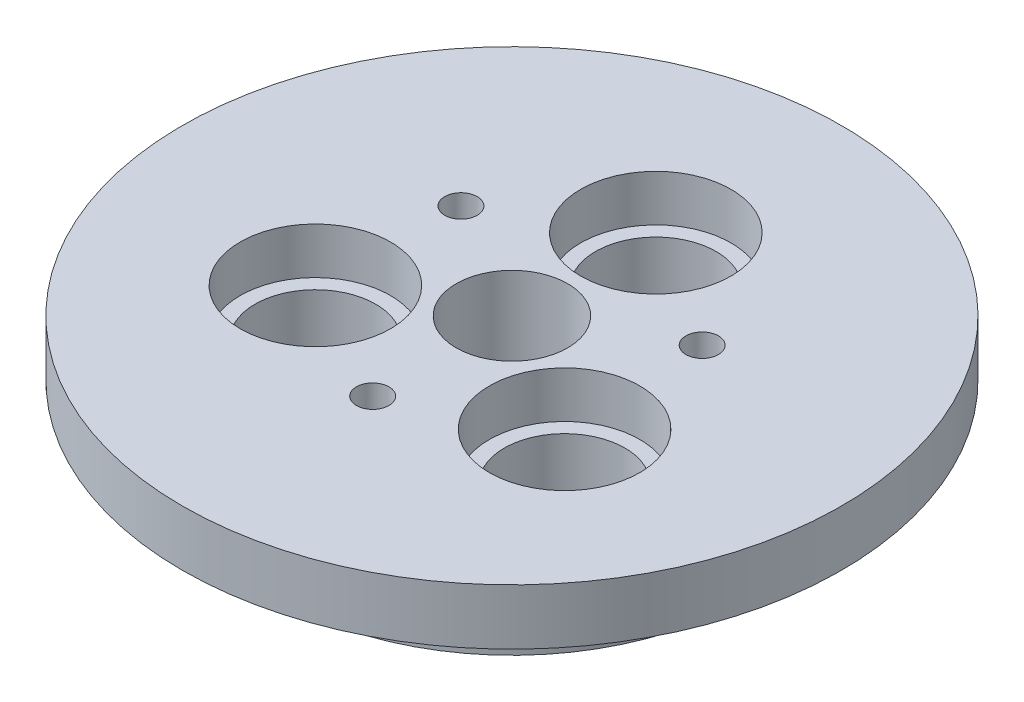
ISO-10303-21;
HEADER;
FILE_DESCRIPTION(('STEP AP214'),'2;1');
FILE_NAME('part.step','',(''),(''),'','','');
FILE_SCHEMA(('AUTOMOTIVE_DESIGN { 1 0 10303 214 1 1 1 1 }'));
ENDSEC;
DATA;
#1=APPLICATION_CONTEXT('core data for automotive mechanical design processes');
#2=APPLICATION_PROTOCOL_DEFINITION('international standard','automotive_design',2000,#1);
#3=PRODUCT_CONTEXT('',#1,'mechanical');
#4=PRODUCT('Part','Part','',(#3));
#5=PRODUCT_RELATED_PRODUCT_CATEGORY('part','',(#4));
#6=PRODUCT_DEFINITION_FORMATION('','',#4);
#7=PRODUCT_DEFINITION_CONTEXT('part definition',#1,'design');
#8=PRODUCT_DEFINITION('design','',#6,#7);
#9=PRODUCT_DEFINITION_SHAPE('','',#8);
#10=(LENGTH_UNIT() NAMED_UNIT(*) SI_UNIT(.MILLI.,.METRE.));
#11=(NAMED_UNIT(*) PLANE_ANGLE_UNIT() SI_UNIT($,.RADIAN.));
#12=(NAMED_UNIT(*) SI_UNIT($,.STERADIAN.) SOLID_ANGLE_UNIT());
#13=UNCERTAINTY_MEASURE_WITH_UNIT(LENGTH_MEASURE(1.E-05),#10,'distance_accuracy_value','');
#14=(GEOMETRIC_REPRESENTATION_CONTEXT(3) GLOBAL_UNCERTAINTY_ASSIGNED_CONTEXT((#13)) GLOBAL_UNIT_ASSIGNED_CONTEXT((#10,
#11,#12)) REPRESENTATION_CONTEXT('',''));
#15=CARTESIAN_POINT('',(0.,0.,0.));
#16=DIRECTION('',(0.,0.,1.));
#17=DIRECTION('',(1.,0.,0.));
#18=AXIS2_PLACEMENT_3D('',#15,#16,#17);
#19=CARTESIAN_POINT('',(0.,-3.,0.));
#20=DIRECTION('',(0.,1.,0.));
#21=DIRECTION('',(0.,0.,1.));
#22=AXIS2_PLACEMENT_3D('',#19,#20,#21);
#23=PLANE('',#22);
#24=CARTESIAN_POINT('',(0.,-3.,0.));
#25=DIRECTION('',(0.,1.,0.));
#26=DIRECTION('',(0.,0.,1.));
#27=AXIS2_PLACEMENT_3D('',#24,#25,#26);
#28=CIRCLE('',#27,27.);
#29=CARTESIAN_POINT('',(0.,-3.,27.));
#30=VERTEX_POINT('',#29);
#31=EDGE_CURVE('E10',#30,#30,#28,.T.);
#32=ORIENTED_EDGE('',*,*,#31,.T.);
#33=EDGE_LOOP('',(#32));
#34=FACE_BOUND('',#33,.T.);
#35=CARTESIAN_POINT('',(0.,-3.,0.));
#36=DIRECTION('',(0.,1.,0.));
#37=DIRECTION('',(0.,0.,1.));
#38=AXIS2_PLACEMENT_3D('',#35,#36,#37);
#39=CIRCLE('',#38,35.5);
#40=CARTESIAN_POINT('',(0.,-3.,35.5));
#41=VERTEX_POINT('',#40);
#42=EDGE_CURVE('E45',#41,#41,#39,.T.);
#43=ORIENTED_EDGE('',*,*,#42,.F.);
#44=EDGE_LOOP('',(#43));
#45=FACE_BOUND('',#44,.T.);
#46=ADVANCED_FACE('F33',(#34,#45),#23,.F.);
#47=CARTESIAN_POINT('',(0.,3.,0.));
#48=DIRECTION('',(0.,-1.,0.));
#49=DIRECTION('',(0.,0.,-1.));
#50=AXIS2_PLACEMENT_3D('',#47,#48,#49);
#51=CYLINDRICAL_SURFACE('',#50,35.5);
#52=CARTESIAN_POINT('',(0.,3.,0.));
#53=DIRECTION('',(0.,1.,0.));
#54=DIRECTION('',(0.,0.,1.));
#55=AXIS2_PLACEMENT_3D('',#52,#53,#54);
#56=CIRCLE('',#55,35.5);
#57=CARTESIAN_POINT('',(0.,3.,35.5));
#58=VERTEX_POINT('',#57);
#59=EDGE_CURVE('E41',#58,#58,#56,.T.);
#60=ORIENTED_EDGE('',*,*,#59,.F.);
#61=EDGE_LOOP('',(#60));
#62=FACE_BOUND('',#61,.T.);
#63=ORIENTED_EDGE('',*,*,#42,.T.);
#64=EDGE_LOOP('',(#63));
#65=FACE_BOUND('',#64,.T.);
#66=ADVANCED_FACE('F149',(#62,#65),#51,.T.);
#67=CARTESIAN_POINT('',(0.,3.,0.));
#68=DIRECTION('',(0.,1.,0.));
#69=DIRECTION('',(0.,0.,1.));
#70=AXIS2_PLACEMENT_3D('',#67,#68,#69);
#71=PLANE('',#70);
#72=CARTESIAN_POINT('',(0.,3.,-15.5));
#73=DIRECTION('',(0.,1.,0.));
#74=DIRECTION('',(0.,0.,1.));
#75=AXIS2_PLACEMENT_3D('',#72,#73,#74);
#76=CIRCLE('',#75,8.1);
#77=CARTESIAN_POINT('',(0.,3.,-7.4));
#78=VERTEX_POINT('',#77);
#79=EDGE_CURVE('E98',#78,#78,#76,.T.);
#80=ORIENTED_EDGE('',*,*,#79,.F.);
#81=EDGE_LOOP('',(#80));
#82=FACE_BOUND('',#81,.T.);
#83=CARTESIAN_POINT('',(13.4233937586588,3.,7.74999999999999));
#84=DIRECTION('',(0.,1.,0.));
#85=DIRECTION('',(0.,0.,1.));
#86=AXIS2_PLACEMENT_3D('',#83,#84,#85);
#87=CIRCLE('',#86,8.10000000000009);
#88=CARTESIAN_POINT('',(13.4233937586588,3.,15.8500000000001));
#89=VERTEX_POINT('',#88);
#90=EDGE_CURVE('E92',#89,#89,#87,.T.);
#91=ORIENTED_EDGE('',*,*,#90,.F.);
#92=EDGE_LOOP('',(#91));
#93=FACE_BOUND('',#92,.T.);
#94=CARTESIAN_POINT('',(-13.4233937586588,3.,7.74999999999999));
#95=DIRECTION('',(0.,1.,0.));
#96=DIRECTION('',(0.,0.,1.));
#97=AXIS2_PLACEMENT_3D('',#94,#95,#96);
#98=CIRCLE('',#97,8.1);
#99=CARTESIAN_POINT('',(-13.4233937586588,3.,15.85));
#100=VERTEX_POINT('',#99);
#101=EDGE_CURVE('E85',#100,#100,#98,.T.);
#102=ORIENTED_EDGE('',*,*,#101,.F.);
#103=EDGE_LOOP('',(#102));
#104=FACE_BOUND('',#103,.T.);
#105=ORIENTED_EDGE('',*,*,#59,.T.);
#106=EDGE_LOOP('',(#105));
#107=FACE_BOUND('',#106,.T.);
#108=CARTESIAN_POINT('',(12.9903810567666,3.,-7.50000000000001));
#109=DIRECTION('',(0.,-1.,0.));
#110=DIRECTION('',(0.,0.,-1.));
#111=AXIS2_PLACEMENT_3D('',#108,#109,#110);
#112=CIRCLE('',#111,1.75);
#113=CARTESIAN_POINT('',(12.9903810567666,3.,-9.25000000000001));
#114=VERTEX_POINT('',#113);
#115=EDGE_CURVE('E75',#114,#114,#112,.F.);
#116=ORIENTED_EDGE('',*,*,#115,.F.);
#117=EDGE_LOOP('',(#116));
#118=FACE_BOUND('',#117,.T.);
#119=CARTESIAN_POINT('',(0.,3.,15.));
#120=DIRECTION('',(0.,-1.,0.));
#121=DIRECTION('',(0.,0.,-1.));
#122=AXIS2_PLACEMENT_3D('',#119,#120,#121);
#123=CIRCLE('',#122,1.75);
#124=CARTESIAN_POINT('',(0.,3.,13.25));
#125=VERTEX_POINT('',#124);
#126=EDGE_CURVE('E81',#125,#125,#123,.F.);
#127=ORIENTED_EDGE('',*,*,#126,.F.);
#128=EDGE_LOOP('',(#127));
#129=FACE_BOUND('',#128,.T.);
#130=CARTESIAN_POINT('',(-12.9903810567666,3.,-7.5));
#131=DIRECTION('',(0.,-1.,0.));
#132=DIRECTION('',(0.,0.,-1.));
#133=AXIS2_PLACEMENT_3D('',#130,#131,#132);
#134=CIRCLE('',#133,1.75);
#135=CARTESIAN_POINT('',(-12.9903810567666,3.,-9.25));
#136=VERTEX_POINT('',#135);
#137=EDGE_CURVE('E78',#136,#136,#134,.F.);
#138=ORIENTED_EDGE('',*,*,#137,.F.);
#139=EDGE_LOOP('',(#138));
#140=FACE_BOUND('',#139,.T.);
#141=CARTESIAN_POINT('',(0.,3.,0.));
#142=DIRECTION('',(0.,-1.,0.));
#143=DIRECTION('',(0.,0.,-1.));
#144=AXIS2_PLACEMENT_3D('',#141,#142,#143);
#145=CIRCLE('',#144,6.);
#146=CARTESIAN_POINT('',(0.,3.,6.));
#147=VERTEX_POINT('',#146);
#148=EDGE_CURVE('E72',#147,#147,#145,.F.);
#149=ORIENTED_EDGE('',*,*,#148,.F.);
#150=EDGE_LOOP('',(#149));
#151=FACE_BOUND('',#150,.T.);
#152=ADVANCED_FACE('F145',(#82,#93,#104,#107,#118,#129,#140,#151),#71,.T.);
#153=CARTESIAN_POINT('',(0.,-3.,0.));
#154=DIRECTION('',(0.,1.,0.));
#155=DIRECTION('',(0.,0.,1.));
#156=AXIS2_PLACEMENT_3D('',#153,#154,#155);
#157=CYLINDRICAL_SURFACE('',#156,6.);
#158=CARTESIAN_POINT('',(0.,-11.,0.));
#159=DIRECTION('',(0.,-1.,0.));
#160=DIRECTION('',(0.,0.,-1.));
#161=AXIS2_PLACEMENT_3D('',#158,#159,#160);
#162=CIRCLE('',#161,6.);
#163=CARTESIAN_POINT('',(0.,-11.,6.));
#164=VERTEX_POINT('',#163);
#165=EDGE_CURVE('E54',#164,#164,#162,.T.);
#166=CARTESIAN_POINT('',(0.,3.,6.));
#167=CARTESIAN_POINT('',(0.,2.85416666666667,6.));
#168=CARTESIAN_POINT('',(0.,2.70833333333333,6.));
#169=CARTESIAN_POINT('',(0.,2.41666666666667,6.));
#170=CARTESIAN_POINT('',(0.,2.27083333333333,6.));
#171=CARTESIAN_POINT('',(0.,1.97916666666667,6.));
#172=CARTESIAN_POINT('',(0.,1.83333333333333,6.));
#173=CARTESIAN_POINT('',(0.,1.54166666666667,6.));
#174=CARTESIAN_POINT('',(0.,1.39583333333333,6.));
#175=CARTESIAN_POINT('',(0.,1.10416666666667,6.));
#176=CARTESIAN_POINT('',(0.,0.958333333333334,6.));
#177=CARTESIAN_POINT('',(0.,0.666666666666667,6.));
#178=CARTESIAN_POINT('',(0.,0.520833333333334,6.));
#179=CARTESIAN_POINT('',(0.,0.229166666666667,6.));
#180=CARTESIAN_POINT('',(0.,0.0833333333333337,6.));
#181=CARTESIAN_POINT('',(0.,-0.208333333333333,6.));
#182=CARTESIAN_POINT('',(0.,-0.354166666666666,6.));
#183=CARTESIAN_POINT('',(0.,-0.645833333333333,6.));
#184=CARTESIAN_POINT('',(0.,-0.791666666666666,6.));
#185=CARTESIAN_POINT('',(0.,-1.08333333333333,6.));
#186=CARTESIAN_POINT('',(0.,-1.22916666666667,6.));
#187=CARTESIAN_POINT('',(0.,-1.52083333333333,6.));
#188=CARTESIAN_POINT('',(0.,-1.66666666666667,6.));
#189=CARTESIAN_POINT('',(0.,-1.95833333333333,6.));
#190=CARTESIAN_POINT('',(0.,-2.10416666666667,6.));
#191=CARTESIAN_POINT('',(0.,-2.39583333333333,6.));
#192=CARTESIAN_POINT('',(0.,-2.54166666666667,6.));
#193=CARTESIAN_POINT('',(0.,-2.83333333333333,6.));
#194=CARTESIAN_POINT('',(0.,-2.97916666666667,6.));
#195=CARTESIAN_POINT('',(0.,-3.27083333333333,6.));
#196=CARTESIAN_POINT('',(0.,-3.41666666666667,6.));
#197=CARTESIAN_POINT('',(0.,-3.70833333333333,6.));
#198=CARTESIAN_POINT('',(0.,-3.85416666666667,6.));
#199=CARTESIAN_POINT('',(0.,-4.14583333333333,6.));
#200=CARTESIAN_POINT('',(0.,-4.29166666666667,6.));
#201=CARTESIAN_POINT('',(0.,-4.58333333333333,6.));
#202=CARTESIAN_POINT('',(0.,-4.72916666666667,6.));
#203=CARTESIAN_POINT('',(0.,-5.02083333333333,6.));
#204=CARTESIAN_POINT('',(0.,-5.16666666666667,6.));
#205=CARTESIAN_POINT('',(0.,-5.45833333333333,6.));
#206=CARTESIAN_POINT('',(0.,-5.60416666666667,6.));
#207=CARTESIAN_POINT('',(0.,-5.89583333333333,6.));
#208=CARTESIAN_POINT('',(0.,-6.04166666666667,6.));
#209=CARTESIAN_POINT('',(0.,-6.33333333333333,6.));
#210=CARTESIAN_POINT('',(0.,-6.47916666666667,6.));
#211=CARTESIAN_POINT('',(0.,-6.77083333333333,6.));
#212=CARTESIAN_POINT('',(0.,-6.91666666666667,6.));
#213=CARTESIAN_POINT('',(0.,-7.20833333333333,6.));
#214=CARTESIAN_POINT('',(0.,-7.35416666666667,6.));
#215=CARTESIAN_POINT('',(0.,-7.64583333333333,6.));
#216=CARTESIAN_POINT('',(0.,-7.79166666666667,6.));
#217=CARTESIAN_POINT('',(0.,-8.08333333333333,6.));
#218=CARTESIAN_POINT('',(0.,-8.22916666666666,6.));
#219=CARTESIAN_POINT('',(0.,-8.52083333333333,6.));
#220=CARTESIAN_POINT('',(0.,-8.66666666666666,6.));
#221=CARTESIAN_POINT('',(0.,-8.95833333333333,6.));
#222=CARTESIAN_POINT('',(0.,-9.10416666666666,6.));
#223=CARTESIAN_POINT('',(0.,-9.39583333333333,6.));
#224=CARTESIAN_POINT('',(0.,-9.54166666666667,6.));
#225=CARTESIAN_POINT('',(0.,-9.83333333333333,6.));
#226=CARTESIAN_POINT('',(0.,-9.97916666666667,6.));
#227=CARTESIAN_POINT('',(0.,-10.2708333333333,6.));
#228=CARTESIAN_POINT('',(0.,-10.4166666666667,6.));
#229=CARTESIAN_POINT('',(0.,-10.7083333333333,6.));
#230=CARTESIAN_POINT('',(0.,-10.8541666666667,6.));
#231=CARTESIAN_POINT('',(0.,-11.,6.));
#232=B_SPLINE_CURVE_WITH_KNOTS('',3,(#166,#167,#168,#169,#170,#171,#172,#173,#174,#175,#176,
#177,#178,#179,#180,#181,#182,#183,#184,#185,#186,#187,#188,#189,#190,#191,#192,#193,#194,#195,
#196,#197,#198,#199,#200,#201,#202,#203,#204,#205,#206,#207,#208,#209,#210,#211,#212,#213,#214,
#215,#216,#217,#218,#219,#220,#221,#222,#223,#224,#225,#226,#227,#228,#229,#230,#231),
.UNSPECIFIED.,.F.,.F.,(4,2,2,2,2,2,2,2,2,2,2,2,2,2,2,2,2,2,2,2,2,2,2,2,2,2,2,2,2,2,2,2,4),(0.,
0.4375,0.875,1.3125,1.75,2.1875,2.625,3.0625,3.5,3.9375,4.375,4.8125,5.25,5.6875,6.125,6.5625,
7.,7.4375,7.875,8.3125,8.75,9.1875,9.625,10.0625,10.5,10.9375,11.375,11.8125,12.25,12.6875,
13.125,13.5625,14.),.UNSPECIFIED.);
#233=EDGE_CURVE('BSEAM148',#147,#164,#232,.T.);
#234=ORIENTED_EDGE('',*,*,#148,.T.);
#235=ORIENTED_EDGE('',*,*,#165,.T.);
#236=ORIENTED_EDGE('',*,*,#233,.T.);
#237=ORIENTED_EDGE('',*,*,#233,.F.);
#238=EDGE_LOOP('',(#234,#236,#235,#237));
#239=FACE_BOUND('',#238,.T.);
#240=ADVANCED_FACE('F148',(#239),#157,.F.);
#241=CARTESIAN_POINT('',(0.,-11.,0.));
#242=DIRECTION('',(0.,-1.,0.));
#243=DIRECTION('',(0.,0.,-1.));
#244=AXIS2_PLACEMENT_3D('',#241,#242,#243);
#245=PLANE('',#244);
#246=CARTESIAN_POINT('',(0.,-11.,-15.5));
#247=DIRECTION('',(0.,1.,0.));
#248=DIRECTION('',(0.,0.,1.));
#249=AXIS2_PLACEMENT_3D('',#246,#247,#248);
#250=CIRCLE('',#249,6.5);
#251=CARTESIAN_POINT('',(0.,-11.,-9.));
#252=VERTEX_POINT('',#251);
#253=EDGE_CURVE('E89',#252,#252,#250,.T.);
#254=ORIENTED_EDGE('',*,*,#253,.T.);
#255=EDGE_LOOP('',(#254));
#256=FACE_BOUND('',#255,.T.);
#257=CARTESIAN_POINT('',(13.4233937586588,-11.,7.74999999999999));
#258=DIRECTION('',(0.,1.,0.));
#259=DIRECTION('',(0.,0.,1.));
#260=AXIS2_PLACEMENT_3D('',#257,#258,#259);
#261=CIRCLE('',#260,6.50000000000001);
#262=CARTESIAN_POINT('',(13.4233937586588,-11.,14.25));
#263=VERTEX_POINT('',#262);
#264=EDGE_CURVE('E112',#263,#263,#261,.T.);
#265=ORIENTED_EDGE('',*,*,#264,.T.);
#266=EDGE_LOOP('',(#265));
#267=FACE_BOUND('',#266,.T.);
#268=CARTESIAN_POINT('',(-13.4233937586588,-11.,7.74999999999999));
#269=DIRECTION('',(0.,1.,0.));
#270=DIRECTION('',(0.,0.,1.));
#271=AXIS2_PLACEMENT_3D('',#268,#269,#270);
#272=CIRCLE('',#271,6.5);
#273=CARTESIAN_POINT('',(-13.4233937586588,-11.,14.25));
#274=VERTEX_POINT('',#273);
#275=EDGE_CURVE('E106',#274,#274,#272,.T.);
#276=ORIENTED_EDGE('',*,*,#275,.T.);
#277=EDGE_LOOP('',(#276));
#278=FACE_BOUND('',#277,.T.);
#279=CARTESIAN_POINT('',(0.,-11.,15.));
#280=DIRECTION('',(0.,1.,0.));
#281=DIRECTION('',(0.,0.,1.));
#282=AXIS2_PLACEMENT_3D('',#279,#280,#281);
#283=CIRCLE('',#282,1.75);
#284=CARTESIAN_POINT('',(0.,-11.,16.75));
#285=VERTEX_POINT('',#284);
#286=EDGE_CURVE('E57',#285,#285,#283,.T.);
#287=ORIENTED_EDGE('',*,*,#286,.T.);
#288=EDGE_LOOP('',(#287));
#289=FACE_BOUND('',#288,.T.);
#290=CARTESIAN_POINT('',(-12.9903810567666,-11.,-7.5));
#291=DIRECTION('',(0.,1.,0.));
#292=DIRECTION('',(0.,0.,1.));
#293=AXIS2_PLACEMENT_3D('',#290,#291,#292);
#294=CIRCLE('',#293,1.75);
#295=CARTESIAN_POINT('',(-12.9903810567666,-11.,-5.75));
#296=VERTEX_POINT('',#295);
#297=EDGE_CURVE('E61',#296,#296,#294,.T.);
#298=ORIENTED_EDGE('',*,*,#297,.T.);
#299=EDGE_LOOP('',(#298));
#300=FACE_BOUND('',#299,.T.);
#301=CARTESIAN_POINT('',(12.9903810567666,-11.,-7.50000000000001));
#302=DIRECTION('',(0.,1.,0.));
#303=DIRECTION('',(0.,0.,1.));
#304=AXIS2_PLACEMENT_3D('',#301,#302,#303);
#305=CIRCLE('',#304,1.75);
#306=CARTESIAN_POINT('',(12.9903810567666,-11.,-5.75000000000001));
#307=VERTEX_POINT('',#306);
#308=EDGE_CURVE('E58',#307,#307,#305,.T.);
#309=ORIENTED_EDGE('',*,*,#308,.T.);
#310=EDGE_LOOP('',(#309));
#311=FACE_BOUND('',#310,.T.);
#312=ORIENTED_EDGE('',*,*,#165,.F.);
#313=EDGE_LOOP('',(#312));
#314=FACE_BOUND('',#313,.T.);
#315=CARTESIAN_POINT('',(0.,-11.,0.));
#316=DIRECTION('',(0.,-1.,0.));
#317=DIRECTION('',(0.,0.,-1.));
#318=AXIS2_PLACEMENT_3D('',#315,#316,#317);
#319=CIRCLE('',#318,25.);
#320=CARTESIAN_POINT('',(0.,-11.,-25.));
#321=VERTEX_POINT('',#320);
#322=EDGE_CURVE('E50',#321,#321,#319,.T.);
#323=ORIENTED_EDGE('',*,*,#322,.T.);
#324=EDGE_LOOP('',(#323));
#325=FACE_BOUND('',#324,.T.);
#326=ADVANCED_FACE('F121',(#256,#267,#278,#289,#300,#311,#314,#325),#245,.T.);
#327=CARTESIAN_POINT('',(0.,-11.,0.));
#328=DIRECTION('',(0.,1.,0.));
#329=DIRECTION('',(0.,0.,1.));
#330=AXIS2_PLACEMENT_3D('',#327,#328,#329);
#331=CYLINDRICAL_SURFACE('',#330,25.);
#332=CARTESIAN_POINT('',(0.,-4.,0.));
#333=DIRECTION('',(0.,-1.,0.));
#334=DIRECTION('',(0.,0.,-1.));
#335=AXIS2_PLACEMENT_3D('',#332,#333,#334);
#336=CIRCLE('',#335,25.);
#337=CARTESIAN_POINT('',(0.,-4.,-25.));
#338=VERTEX_POINT('',#337);
#339=EDGE_CURVE('E69',#338,#338,#336,.T.);
#340=ORIENTED_EDGE('',*,*,#339,.T.);
#341=EDGE_LOOP('',(#340));
#342=FACE_BOUND('',#341,.T.);
#343=ORIENTED_EDGE('',*,*,#322,.F.);
#344=EDGE_LOOP('',(#343));
#345=FACE_BOUND('',#344,.T.);
#346=ADVANCED_FACE('F170',(#342,#345),#331,.T.);
#347=CARTESIAN_POINT('',(12.9903810567666,-11.,-7.50000000000001));
#348=DIRECTION('',(0.,1.,0.));
#349=DIRECTION('',(0.,0.,1.));
#350=AXIS2_PLACEMENT_3D('',#347,#348,#349);
#351=CYLINDRICAL_SURFACE('',#350,1.75);
#352=ORIENTED_EDGE('',*,*,#115,.T.);
#353=EDGE_LOOP('',(#352));
#354=FACE_BOUND('',#353,.T.);
#355=ORIENTED_EDGE('',*,*,#308,.F.);
#356=EDGE_LOOP('',(#355));
#357=FACE_BOUND('',#356,.T.);
#358=ADVANCED_FACE('F175',(#354,#357),#351,.F.);
#359=CARTESIAN_POINT('',(-12.9903810567666,-11.,-7.5));
#360=DIRECTION('',(0.,1.,0.));
#361=DIRECTION('',(0.,0.,1.));
#362=AXIS2_PLACEMENT_3D('',#359,#360,#361);
#363=CYLINDRICAL_SURFACE('',#362,1.75);
#364=ORIENTED_EDGE('',*,*,#137,.T.);
#365=EDGE_LOOP('',(#364));
#366=FACE_BOUND('',#365,.T.);
#367=ORIENTED_EDGE('',*,*,#297,.F.);
#368=EDGE_LOOP('',(#367));
#369=FACE_BOUND('',#368,.T.);
#370=ADVANCED_FACE('F181',(#366,#369),#363,.F.);
#371=CARTESIAN_POINT('',(0.,-11.,15.));
#372=DIRECTION('',(0.,1.,0.));
#373=DIRECTION('',(0.,0.,1.));
#374=AXIS2_PLACEMENT_3D('',#371,#372,#373);
#375=CYLINDRICAL_SURFACE('',#374,1.75);
#376=ORIENTED_EDGE('',*,*,#126,.T.);
#377=EDGE_LOOP('',(#376));
#378=FACE_BOUND('',#377,.T.);
#379=ORIENTED_EDGE('',*,*,#286,.F.);
#380=EDGE_LOOP('',(#379));
#381=FACE_BOUND('',#380,.T.);
#382=ADVANCED_FACE('F286',(#378,#381),#375,.F.);
#383=CARTESIAN_POINT('',(0.,-4.,0.));
#384=DIRECTION('',(0.,-1.,0.));
#385=DIRECTION('',(0.,0.,-1.));
#386=AXIS2_PLACEMENT_3D('',#383,#384,#385);
#387=PLANE('',#386);
#388=CARTESIAN_POINT('',(0.,-4.,0.));
#389=DIRECTION('',(0.,-1.,0.));
#390=DIRECTION('',(0.,0.,-1.));
#391=AXIS2_PLACEMENT_3D('',#388,#389,#390);
#392=CIRCLE('',#391,26.);
#393=CARTESIAN_POINT('',(0.,-4.,-26.));
#394=VERTEX_POINT('',#393);
#395=EDGE_CURVE('E62',#394,#394,#392,.T.);
#396=ORIENTED_EDGE('',*,*,#395,.T.);
#397=EDGE_LOOP('',(#396));
#398=FACE_BOUND('',#397,.T.);
#399=ORIENTED_EDGE('',*,*,#339,.F.);
#400=EDGE_LOOP('',(#399));
#401=FACE_BOUND('',#400,.T.);
#402=ADVANCED_FACE('F283',(#398,#401),#387,.T.);
#403=CARTESIAN_POINT('',(0.,-4.00000000000003,0.));
#404=DIRECTION('',(0.,1.,0.));
#405=DIRECTION('',(0.,0.,1.));
#406=AXIS2_PLACEMENT_3D('',#403,#404,#405);
#407=CONICAL_SURFACE('',#406,26.,0.785398163397443);
#408=ORIENTED_EDGE('',*,*,#31,.F.);
#409=EDGE_LOOP('',(#408));
#410=FACE_BOUND('',#409,.T.);
#411=ORIENTED_EDGE('',*,*,#395,.F.);
#412=EDGE_LOOP('',(#411));
#413=FACE_BOUND('',#412,.T.);
#414=ADVANCED_FACE('F36',(#410,#413),#407,.T.);
#415=CARTESIAN_POINT('',(-13.4233937586588,-2.,7.74999999999999));
#416=DIRECTION('',(0.,1.,0.));
#417=DIRECTION('',(0.,0.,1.));
#418=AXIS2_PLACEMENT_3D('',#415,#416,#417);
#419=CYLINDRICAL_SURFACE('',#418,8.1);
#420=CARTESIAN_POINT('',(-13.4233937586588,-2.,7.74999999999999));
#421=DIRECTION('',(0.,1.,0.));
#422=DIRECTION('',(0.,0.,1.));
#423=AXIS2_PLACEMENT_3D('',#420,#421,#422);
#424=CIRCLE('',#423,8.1);
#425=CARTESIAN_POINT('',(-13.4233937586588,-2.,15.85));
#426=VERTEX_POINT('',#425);
#427=EDGE_CURVE('E88',#426,#426,#424,.T.);
#428=ORIENTED_EDGE('',*,*,#427,.F.);
#429=EDGE_LOOP('',(#428));
#430=FACE_BOUND('',#429,.T.);
#431=ORIENTED_EDGE('',*,*,#101,.T.);
#432=EDGE_LOOP('',(#431));
#433=FACE_BOUND('',#432,.T.);
#434=ADVANCED_FACE('F228',(#430,#433),#419,.F.);
#435=CARTESIAN_POINT('',(-13.4233937586588,-2.,7.74999999999999));
#436=DIRECTION('',(0.,1.,0.));
#437=DIRECTION('',(0.,0.,1.));
#438=AXIS2_PLACEMENT_3D('',#435,#436,#437);
#439=PLANE('',#438);
#440=CARTESIAN_POINT('',(-13.4233937586588,-2.,7.74999999999999));
#441=DIRECTION('',(0.,1.,0.));
#442=DIRECTION('',(0.,0.,1.));
#443=AXIS2_PLACEMENT_3D('',#440,#441,#442);
#444=CIRCLE('',#443,6.5);
#445=CARTESIAN_POINT('',(-13.4233937586588,-2.,14.25));
#446=VERTEX_POINT('',#445);
#447=EDGE_CURVE('E103',#446,#446,#444,.T.);
#448=ORIENTED_EDGE('',*,*,#447,.F.);
#449=EDGE_LOOP('',(#448));
#450=FACE_BOUND('',#449,.T.);
#451=ORIENTED_EDGE('',*,*,#427,.T.);
#452=EDGE_LOOP('',(#451));
#453=FACE_BOUND('',#452,.T.);
#454=ADVANCED_FACE('F222',(#450,#453),#439,.T.);
#455=CARTESIAN_POINT('',(13.4233937586588,-2.,7.74999999999999));
#456=DIRECTION('',(0.,1.,0.));
#457=DIRECTION('',(0.,0.,1.));
#458=AXIS2_PLACEMENT_3D('',#455,#456,#457);
#459=CYLINDRICAL_SURFACE('',#458,8.10000000000009);
#460=CARTESIAN_POINT('',(13.4233937586588,-2.,7.74999999999999));
#461=DIRECTION('',(0.,1.,0.));
#462=DIRECTION('',(0.,0.,1.));
#463=AXIS2_PLACEMENT_3D('',#460,#461,#462);
#464=CIRCLE('',#463,8.10000000000009);
#465=CARTESIAN_POINT('',(13.4233937586588,-2.,15.8500000000001));
#466=VERTEX_POINT('',#465);
#467=EDGE_CURVE('E95',#466,#466,#464,.T.);
#468=ORIENTED_EDGE('',*,*,#467,.F.);
#469=EDGE_LOOP('',(#468));
#470=FACE_BOUND('',#469,.T.);
#471=ORIENTED_EDGE('',*,*,#90,.T.);
#472=EDGE_LOOP('',(#471));
#473=FACE_BOUND('',#472,.T.);
#474=ADVANCED_FACE('F227',(#470,#473),#459,.F.);
#475=CARTESIAN_POINT('',(13.4233937586588,-2.,7.74999999999999));
#476=DIRECTION('',(0.,1.,0.));
#477=DIRECTION('',(0.,0.,1.));
#478=AXIS2_PLACEMENT_3D('',#475,#476,#477);
#479=PLANE('',#478);
#480=CARTESIAN_POINT('',(13.4233937586588,-2.,7.74999999999999));
#481=DIRECTION('',(0.,1.,0.));
#482=DIRECTION('',(0.,0.,1.));
#483=AXIS2_PLACEMENT_3D('',#480,#481,#482);
#484=CIRCLE('',#483,6.50000000000001);
#485=CARTESIAN_POINT('',(13.4233937586588,-2.,14.25));
#486=VERTEX_POINT('',#485);
#487=EDGE_CURVE('E109',#486,#486,#484,.T.);
#488=ORIENTED_EDGE('',*,*,#487,.F.);
#489=EDGE_LOOP('',(#488));
#490=FACE_BOUND('',#489,.T.);
#491=ORIENTED_EDGE('',*,*,#467,.T.);
#492=EDGE_LOOP('',(#491));
#493=FACE_BOUND('',#492,.T.);
#494=ADVANCED_FACE('F141',(#490,#493),#479,.T.);
#495=CARTESIAN_POINT('',(0.,-2.,-15.5));
#496=DIRECTION('',(0.,1.,0.));
#497=DIRECTION('',(0.,0.,1.));
#498=AXIS2_PLACEMENT_3D('',#495,#496,#497);
#499=CYLINDRICAL_SURFACE('',#498,8.1);
#500=CARTESIAN_POINT('',(0.,-2.,-15.5));
#501=DIRECTION('',(0.,1.,0.));
#502=DIRECTION('',(0.,0.,1.));
#503=AXIS2_PLACEMENT_3D('',#500,#501,#502);
#504=CIRCLE('',#503,8.1);
#505=CARTESIAN_POINT('',(0.,-2.,-7.4));
#506=VERTEX_POINT('',#505);
#507=EDGE_CURVE('E84',#506,#506,#504,.T.);
#508=ORIENTED_EDGE('',*,*,#507,.F.);
#509=EDGE_LOOP('',(#508));
#510=FACE_BOUND('',#509,.T.);
#511=ORIENTED_EDGE('',*,*,#79,.T.);
#512=EDGE_LOOP('',(#511));
#513=FACE_BOUND('',#512,.T.);
#514=ADVANCED_FACE('F135',(#510,#513),#499,.F.);
#515=CARTESIAN_POINT('',(0.,-2.,-15.5));
#516=DIRECTION('',(0.,1.,0.));
#517=DIRECTION('',(0.,0.,1.));
#518=AXIS2_PLACEMENT_3D('',#515,#516,#517);
#519=PLANE('',#518);
#520=CARTESIAN_POINT('',(0.,-2.,-15.5));
#521=DIRECTION('',(0.,1.,0.));
#522=DIRECTION('',(0.,0.,1.));
#523=AXIS2_PLACEMENT_3D('',#520,#521,#522);
#524=CIRCLE('',#523,6.5);
#525=CARTESIAN_POINT('',(0.,-2.,-9.));
#526=VERTEX_POINT('',#525);
#527=EDGE_CURVE('E115',#526,#526,#524,.T.);
#528=ORIENTED_EDGE('',*,*,#527,.F.);
#529=EDGE_LOOP('',(#528));
#530=FACE_BOUND('',#529,.T.);
#531=ORIENTED_EDGE('',*,*,#507,.T.);
#532=EDGE_LOOP('',(#531));
#533=FACE_BOUND('',#532,.T.);
#534=ADVANCED_FACE('F131',(#530,#533),#519,.T.);
#535=CARTESIAN_POINT('',(-13.4233937586588,-11.,7.74999999999999));
#536=DIRECTION('',(0.,1.,0.));
#537=DIRECTION('',(0.,0.,1.));
#538=AXIS2_PLACEMENT_3D('',#535,#536,#537);
#539=CYLINDRICAL_SURFACE('',#538,6.5);
#540=ORIENTED_EDGE('',*,*,#275,.F.);
#541=EDGE_LOOP('',(#540));
#542=FACE_BOUND('',#541,.T.);
#543=ORIENTED_EDGE('',*,*,#447,.T.);
#544=EDGE_LOOP('',(#543));
#545=FACE_BOUND('',#544,.T.);
#546=ADVANCED_FACE('F134',(#542,#545),#539,.F.);
#547=CARTESIAN_POINT('',(13.4233937586588,-11.,7.74999999999999));
#548=DIRECTION('',(0.,1.,0.));
#549=DIRECTION('',(0.,0.,1.));
#550=AXIS2_PLACEMENT_3D('',#547,#548,#549);
#551=CYLINDRICAL_SURFACE('',#550,6.50000000000001);
#552=ORIENTED_EDGE('',*,*,#264,.F.);
#553=EDGE_LOOP('',(#552));
#554=FACE_BOUND('',#553,.T.);
#555=ORIENTED_EDGE('',*,*,#487,.T.);
#556=EDGE_LOOP('',(#555));
#557=FACE_BOUND('',#556,.T.);
#558=ADVANCED_FACE('F127',(#554,#557),#551,.F.);
#559=CARTESIAN_POINT('',(0.,-11.,-15.5));
#560=DIRECTION('',(0.,1.,0.));
#561=DIRECTION('',(0.,0.,1.));
#562=AXIS2_PLACEMENT_3D('',#559,#560,#561);
#563=CYLINDRICAL_SURFACE('',#562,6.5);
#564=ORIENTED_EDGE('',*,*,#253,.F.);
#565=EDGE_LOOP('',(#564));
#566=FACE_BOUND('',#565,.T.);
#567=ORIENTED_EDGE('',*,*,#527,.T.);
#568=EDGE_LOOP('',(#567));
#569=FACE_BOUND('',#568,.T.);
#570=ADVANCED_FACE('F124',(#566,#569),#563,.F.);
#571=CLOSED_SHELL('',(#46,#66,#152,#240,#326,#346,#358,#370,#382,#402,#414,#434,#454,#474,#494,
#514,#534,#546,#558,#570));
#572=MANIFOLD_SOLID_BREP('B2',#571);
#573=ADVANCED_BREP_SHAPE_REPRESENTATION('',(#18,#572),#14);
#574=SHAPE_DEFINITION_REPRESENTATION(#9,#573);
ENDSEC;
END-ISO-10303-21;
